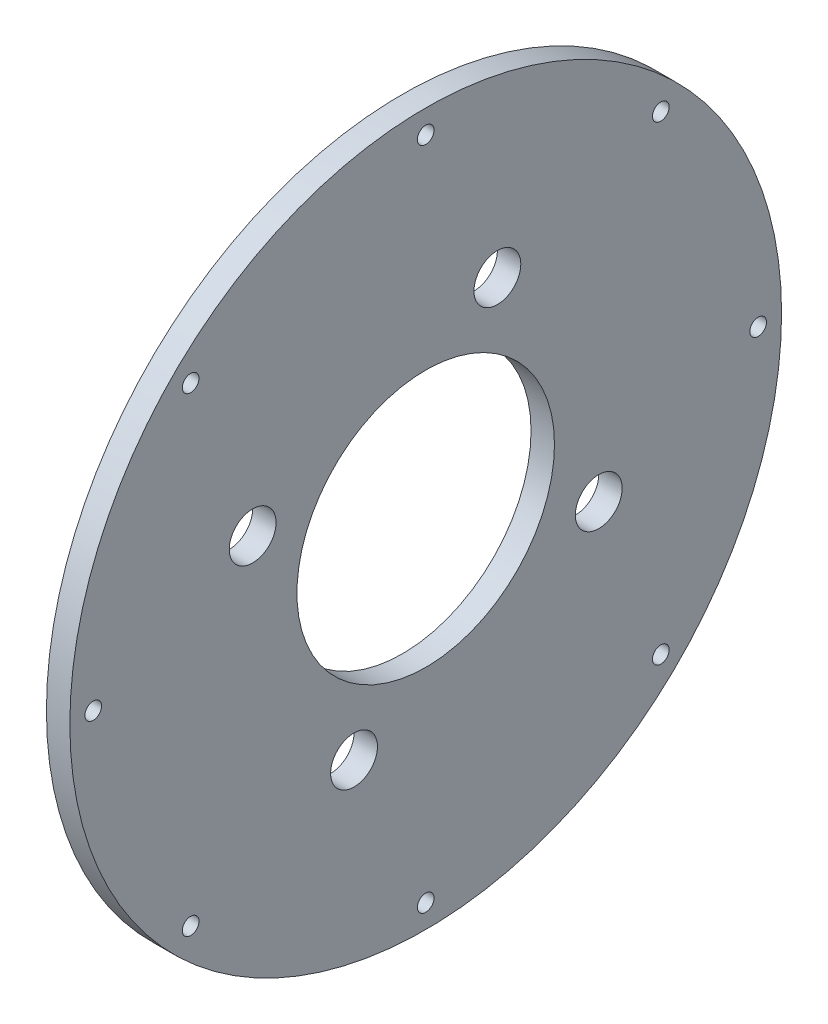
ISO-10303-21;
HEADER;
FILE_DESCRIPTION(('STEP AP214'),'2;1');
FILE_NAME('part.step','',(''),(''),'','','');
FILE_SCHEMA(('AUTOMOTIVE_DESIGN { 1 0 10303 214 1 1 1 1 }'));
ENDSEC;
DATA;
#1=APPLICATION_CONTEXT('core data for automotive mechanical design processes');
#2=APPLICATION_PROTOCOL_DEFINITION('international standard','automotive_design',2000,#1);
#3=PRODUCT_CONTEXT('',#1,'mechanical');
#4=PRODUCT('Part','Part','',(#3));
#5=PRODUCT_RELATED_PRODUCT_CATEGORY('part','',(#4));
#6=PRODUCT_DEFINITION_FORMATION('','',#4);
#7=PRODUCT_DEFINITION_CONTEXT('part definition',#1,'design');
#8=PRODUCT_DEFINITION('design','',#6,#7);
#9=PRODUCT_DEFINITION_SHAPE('','',#8);
#10=(LENGTH_UNIT() NAMED_UNIT(*) SI_UNIT(.MILLI.,.METRE.));
#11=(NAMED_UNIT(*) PLANE_ANGLE_UNIT() SI_UNIT($,.RADIAN.));
#12=(NAMED_UNIT(*) SI_UNIT($,.STERADIAN.) SOLID_ANGLE_UNIT());
#13=UNCERTAINTY_MEASURE_WITH_UNIT(LENGTH_MEASURE(1.E-05),#10,'distance_accuracy_value','');
#14=(GEOMETRIC_REPRESENTATION_CONTEXT(3) GLOBAL_UNCERTAINTY_ASSIGNED_CONTEXT((#13)) GLOBAL_UNIT_ASSIGNED_CONTEXT((#10,
#11,#12)) REPRESENTATION_CONTEXT('',''));
#15=CARTESIAN_POINT('',(0.,0.,0.));
#16=DIRECTION('',(0.,0.,1.));
#17=DIRECTION('',(1.,0.,0.));
#18=AXIS2_PLACEMENT_3D('',#15,#16,#17);
#19=CARTESIAN_POINT('',(3.175,0.,0.));
#20=DIRECTION('',(1.,0.,0.));
#21=DIRECTION('',(0.,0.,-1.));
#22=AXIS2_PLACEMENT_3D('',#19,#20,#21);
#23=PLANE('',#22);
#24=CARTESIAN_POINT('',(3.175,-23.4665401257866,9.72015918207268));
#25=DIRECTION('',(1.,0.,0.));
#26=DIRECTION('',(0.,0.,-1.));
#27=AXIS2_PLACEMENT_3D('',#24,#25,#26);
#28=CIRCLE('',#27,3.175);
#29=CARTESIAN_POINT('',(3.175,-23.4665401257866,6.54515918207267));
#30=VERTEX_POINT('',#29);
#31=EDGE_CURVE('E107',#30,#30,#28,.T.);
#32=ORIENTED_EDGE('',*,*,#31,.F.);
#33=EDGE_LOOP('',(#32));
#34=FACE_BOUND('',#33,.T.);
#35=CARTESIAN_POINT('',(3.175,23.4665401257866,-9.72015918207339));
#36=DIRECTION('',(1.,0.,0.));
#37=DIRECTION('',(0.,0.,-1.));
#38=AXIS2_PLACEMENT_3D('',#35,#36,#37);
#39=CIRCLE('',#38,3.175);
#40=CARTESIAN_POINT('',(3.175,23.4665401257866,-12.8951591820734));
#41=VERTEX_POINT('',#40);
#42=EDGE_CURVE('E95',#41,#41,#39,.T.);
#43=ORIENTED_EDGE('',*,*,#42,.F.);
#44=EDGE_LOOP('',(#43));
#45=FACE_BOUND('',#44,.T.);
#46=CARTESIAN_POINT('',(3.175,-6.5726235503307E-13,45.0849999999994));
#47=DIRECTION('',(1.,0.,0.));
#48=DIRECTION('',(0.,0.,-1.));
#49=AXIS2_PLACEMENT_3D('',#46,#47,#48);
#50=CIRCLE('',#49,1.1303);
#51=CARTESIAN_POINT('',(3.175,-6.5726235503307E-13,43.9546999999994));
#52=VERTEX_POINT('',#51);
#53=EDGE_CURVE('E83',#52,#52,#50,.T.);
#54=ORIENTED_EDGE('',*,*,#53,.F.);
#55=EDGE_LOOP('',(#54));
#56=FACE_BOUND('',#55,.T.);
#57=CARTESIAN_POINT('',(3.175,-45.085,-1.28329082477408E-12));
#58=DIRECTION('',(1.,0.,0.));
#59=DIRECTION('',(0.,0.,-1.));
#60=AXIS2_PLACEMENT_3D('',#57,#58,#59);
#61=CIRCLE('',#60,1.1303);
#62=CARTESIAN_POINT('',(3.175,-45.085,-1.13030000000128));
#63=VERTEX_POINT('',#62);
#64=EDGE_CURVE('E71',#63,#63,#61,.T.);
#65=ORIENTED_EDGE('',*,*,#64,.F.);
#66=EDGE_LOOP('',(#65));
#67=FACE_BOUND('',#66,.T.);
#68=CARTESIAN_POINT('',(3.175,-1.57413436161743E-13,-45.085));
#69=DIRECTION('',(1.,0.,0.));
#70=DIRECTION('',(0.,0.,-1.));
#71=AXIS2_PLACEMENT_3D('',#68,#69,#70);
#72=CIRCLE('',#71,1.1303);
#73=CARTESIAN_POINT('',(3.175,-1.57413436161743E-13,-46.2153));
#74=VERTEX_POINT('',#73);
#75=EDGE_CURVE('E59',#74,#74,#72,.T.);
#76=ORIENTED_EDGE('',*,*,#75,.F.);
#77=EDGE_LOOP('',(#76));
#78=FACE_BOUND('',#77,.T.);
#79=CARTESIAN_POINT('',(3.175,0.,0.));
#80=DIRECTION('',(1.,0.,0.));
#81=DIRECTION('',(0.,0.,-1.));
#82=AXIS2_PLACEMENT_3D('',#79,#80,#81);
#83=CIRCLE('',#82,17.4625);
#84=CARTESIAN_POINT('',(3.175,0.,-17.4625));
#85=VERTEX_POINT('',#84);
#86=EDGE_CURVE('E47',#85,#85,#83,.T.);
#87=ORIENTED_EDGE('',*,*,#86,.F.);
#88=EDGE_LOOP('',(#87));
#89=FACE_BOUND('',#88,.T.);
#90=CARTESIAN_POINT('',(3.175,0.,0.));
#91=DIRECTION('',(1.,0.,0.));
#92=DIRECTION('',(0.,0.,-1.));
#93=AXIS2_PLACEMENT_3D('',#90,#91,#92);
#94=CIRCLE('',#93,48.26);
#95=CARTESIAN_POINT('',(3.175,0.,-48.26));
#96=VERTEX_POINT('',#95);
#97=EDGE_CURVE('E10',#96,#96,#94,.T.);
#98=ORIENTED_EDGE('',*,*,#97,.T.);
#99=EDGE_LOOP('',(#98));
#100=FACE_BOUND('',#99,.T.);
#101=CARTESIAN_POINT('',(3.175,45.085,0.));
#102=DIRECTION('',(1.,0.,0.));
#103=DIRECTION('',(0.,0.,-1.));
#104=AXIS2_PLACEMENT_3D('',#101,#102,#103);
#105=CIRCLE('',#104,1.1303);
#106=CARTESIAN_POINT('',(3.175,45.085,-1.1303));
#107=VERTEX_POINT('',#106);
#108=EDGE_CURVE('E42',#107,#107,#105,.T.);
#109=ORIENTED_EDGE('',*,*,#108,.F.);
#110=EDGE_LOOP('',(#109));
#111=FACE_BOUND('',#110,.T.);
#112=CARTESIAN_POINT('',(3.175,31.8799092297954,-31.8799092297955));
#113=DIRECTION('',(1.,0.,0.));
#114=DIRECTION('',(0.,0.,-1.));
#115=AXIS2_PLACEMENT_3D('',#112,#113,#114);
#116=CIRCLE('',#115,1.1303);
#117=CARTESIAN_POINT('',(3.175,31.8799092297954,-33.0102092297955));
#118=VERTEX_POINT('',#117);
#119=EDGE_CURVE('E53',#118,#118,#116,.T.);
#120=ORIENTED_EDGE('',*,*,#119,.F.);
#121=EDGE_LOOP('',(#120));
#122=FACE_BOUND('',#121,.T.);
#123=CARTESIAN_POINT('',(3.175,-31.879909229795,-31.8799092297966));
#124=DIRECTION('',(1.,0.,0.));
#125=DIRECTION('',(0.,0.,-1.));
#126=AXIS2_PLACEMENT_3D('',#123,#124,#125);
#127=CIRCLE('',#126,1.1303);
#128=CARTESIAN_POINT('',(3.175,-31.879909229795,-33.0102092297966));
#129=VERTEX_POINT('',#128);
#130=EDGE_CURVE('E65',#129,#129,#127,.T.);
#131=ORIENTED_EDGE('',*,*,#130,.F.);
#132=EDGE_LOOP('',(#131));
#133=FACE_BOUND('',#132,.T.);
#134=CARTESIAN_POINT('',(3.175,-31.879909229796,31.8799092297944));
#135=DIRECTION('',(1.,0.,0.));
#136=DIRECTION('',(0.,0.,-1.));
#137=AXIS2_PLACEMENT_3D('',#134,#135,#136);
#138=CIRCLE('',#137,1.1303);
#139=CARTESIAN_POINT('',(3.175,-31.879909229796,30.7496092297944));
#140=VERTEX_POINT('',#139);
#141=EDGE_CURVE('E77',#140,#140,#138,.T.);
#142=ORIENTED_EDGE('',*,*,#141,.F.);
#143=EDGE_LOOP('',(#142));
#144=FACE_BOUND('',#143,.T.);
#145=CARTESIAN_POINT('',(3.175,31.8799092297959,31.8799092297951));
#146=DIRECTION('',(1.,0.,0.));
#147=DIRECTION('',(0.,0.,-1.));
#148=AXIS2_PLACEMENT_3D('',#145,#146,#147);
#149=CIRCLE('',#148,1.1303);
#150=CARTESIAN_POINT('',(3.175,31.8799092297959,30.7496092297951));
#151=VERTEX_POINT('',#150);
#152=EDGE_CURVE('E89',#151,#151,#149,.T.);
#153=ORIENTED_EDGE('',*,*,#152,.F.);
#154=EDGE_LOOP('',(#153));
#155=FACE_BOUND('',#154,.T.);
#156=CARTESIAN_POINT('',(3.175,-9.72015918207303,-23.466540125787));
#157=DIRECTION('',(1.,0.,0.));
#158=DIRECTION('',(0.,0.,-1.));
#159=AXIS2_PLACEMENT_3D('',#156,#157,#158);
#160=CIRCLE('',#159,3.175);
#161=CARTESIAN_POINT('',(3.175,-9.72015918207303,-26.641540125787));
#162=VERTEX_POINT('',#161);
#163=EDGE_CURVE('E101',#162,#162,#160,.T.);
#164=ORIENTED_EDGE('',*,*,#163,.F.);
#165=EDGE_LOOP('',(#164));
#166=FACE_BOUND('',#165,.T.);
#167=CARTESIAN_POINT('',(3.175,9.72015918207304,23.4665401257863));
#168=DIRECTION('',(1.,0.,0.));
#169=DIRECTION('',(0.,0.,-1.));
#170=AXIS2_PLACEMENT_3D('',#167,#168,#169);
#171=CIRCLE('',#170,3.175);
#172=CARTESIAN_POINT('',(3.175,9.72015918207304,20.2915401257863));
#173=VERTEX_POINT('',#172);
#174=EDGE_CURVE('E113',#173,#173,#171,.T.);
#175=ORIENTED_EDGE('',*,*,#174,.F.);
#176=EDGE_LOOP('',(#175));
#177=FACE_BOUND('',#176,.T.);
#178=ADVANCED_FACE('F31',(#34,#45,#56,#67,#78,#89,#100,#111,#122,#133,#144,#155,#166,#177),#23,.T.);
#179=CARTESIAN_POINT('',(0.,0.,0.));
#180=DIRECTION('',(1.,0.,0.));
#181=DIRECTION('',(0.,0.,-1.));
#182=AXIS2_PLACEMENT_3D('',#179,#180,#181);
#183=PLANE('',#182);
#184=CARTESIAN_POINT('',(0.,-23.4665401257866,9.72015918207268));
#185=DIRECTION('',(1.,0.,0.));
#186=DIRECTION('',(0.,0.,-1.));
#187=AXIS2_PLACEMENT_3D('',#184,#185,#186);
#188=CIRCLE('',#187,3.175);
#189=CARTESIAN_POINT('',(0.,-23.4665401257866,6.54515918207267));
#190=VERTEX_POINT('',#189);
#191=EDGE_CURVE('E110',#190,#190,#188,.T.);
#192=ORIENTED_EDGE('',*,*,#191,.T.);
#193=EDGE_LOOP('',(#192));
#194=FACE_BOUND('',#193,.T.);
#195=CARTESIAN_POINT('',(0.,23.4665401257866,-9.72015918207339));
#196=DIRECTION('',(1.,0.,0.));
#197=DIRECTION('',(0.,0.,-1.));
#198=AXIS2_PLACEMENT_3D('',#195,#196,#197);
#199=CIRCLE('',#198,3.175);
#200=CARTESIAN_POINT('',(0.,23.4665401257866,-12.8951591820734));
#201=VERTEX_POINT('',#200);
#202=EDGE_CURVE('E98',#201,#201,#199,.T.);
#203=ORIENTED_EDGE('',*,*,#202,.T.);
#204=EDGE_LOOP('',(#203));
#205=FACE_BOUND('',#204,.T.);
#206=CARTESIAN_POINT('',(0.,-6.5726235503307E-13,45.0849999999994));
#207=DIRECTION('',(1.,0.,0.));
#208=DIRECTION('',(0.,0.,-1.));
#209=AXIS2_PLACEMENT_3D('',#206,#207,#208);
#210=CIRCLE('',#209,1.1303);
#211=CARTESIAN_POINT('',(0.,-6.5726235503307E-13,43.9546999999994));
#212=VERTEX_POINT('',#211);
#213=EDGE_CURVE('E86',#212,#212,#210,.T.);
#214=ORIENTED_EDGE('',*,*,#213,.T.);
#215=EDGE_LOOP('',(#214));
#216=FACE_BOUND('',#215,.T.);
#217=CARTESIAN_POINT('',(0.,-45.085,-1.28329082477408E-12));
#218=DIRECTION('',(1.,0.,0.));
#219=DIRECTION('',(0.,0.,-1.));
#220=AXIS2_PLACEMENT_3D('',#217,#218,#219);
#221=CIRCLE('',#220,1.1303);
#222=CARTESIAN_POINT('',(0.,-45.085,-1.13030000000128));
#223=VERTEX_POINT('',#222);
#224=EDGE_CURVE('E74',#223,#223,#221,.T.);
#225=ORIENTED_EDGE('',*,*,#224,.T.);
#226=EDGE_LOOP('',(#225));
#227=FACE_BOUND('',#226,.T.);
#228=CARTESIAN_POINT('',(0.,-1.57413436161743E-13,-45.085));
#229=DIRECTION('',(1.,0.,0.));
#230=DIRECTION('',(0.,0.,-1.));
#231=AXIS2_PLACEMENT_3D('',#228,#229,#230);
#232=CIRCLE('',#231,1.1303);
#233=CARTESIAN_POINT('',(0.,-1.57413436161743E-13,-46.2153));
#234=VERTEX_POINT('',#233);
#235=EDGE_CURVE('E62',#234,#234,#232,.T.);
#236=ORIENTED_EDGE('',*,*,#235,.T.);
#237=EDGE_LOOP('',(#236));
#238=FACE_BOUND('',#237,.T.);
#239=CARTESIAN_POINT('',(0.,0.,0.));
#240=DIRECTION('',(1.,0.,0.));
#241=DIRECTION('',(0.,0.,-1.));
#242=AXIS2_PLACEMENT_3D('',#239,#240,#241);
#243=CIRCLE('',#242,17.4625);
#244=CARTESIAN_POINT('',(0.,0.,-17.4625));
#245=VERTEX_POINT('',#244);
#246=EDGE_CURVE('E50',#245,#245,#243,.T.);
#247=ORIENTED_EDGE('',*,*,#246,.T.);
#248=EDGE_LOOP('',(#247));
#249=FACE_BOUND('',#248,.T.);
#250=CARTESIAN_POINT('',(0.,0.,0.));
#251=DIRECTION('',(1.,0.,0.));
#252=DIRECTION('',(0.,0.,-1.));
#253=AXIS2_PLACEMENT_3D('',#250,#251,#252);
#254=CIRCLE('',#253,48.26);
#255=CARTESIAN_POINT('',(0.,0.,-48.26));
#256=VERTEX_POINT('',#255);
#257=EDGE_CURVE('E35',#256,#256,#254,.T.);
#258=ORIENTED_EDGE('',*,*,#257,.F.);
#259=EDGE_LOOP('',(#258));
#260=FACE_BOUND('',#259,.T.);
#261=CARTESIAN_POINT('',(0.,45.085,0.));
#262=DIRECTION('',(1.,0.,0.));
#263=DIRECTION('',(0.,0.,-1.));
#264=AXIS2_PLACEMENT_3D('',#261,#262,#263);
#265=CIRCLE('',#264,1.1303);
#266=CARTESIAN_POINT('',(0.,45.085,-1.1303));
#267=VERTEX_POINT('',#266);
#268=EDGE_CURVE('E44',#267,#267,#265,.T.);
#269=ORIENTED_EDGE('',*,*,#268,.T.);
#270=EDGE_LOOP('',(#269));
#271=FACE_BOUND('',#270,.T.);
#272=CARTESIAN_POINT('',(0.,31.8799092297954,-31.8799092297955));
#273=DIRECTION('',(1.,0.,0.));
#274=DIRECTION('',(0.,0.,-1.));
#275=AXIS2_PLACEMENT_3D('',#272,#273,#274);
#276=CIRCLE('',#275,1.1303);
#277=CARTESIAN_POINT('',(0.,31.8799092297954,-33.0102092297955));
#278=VERTEX_POINT('',#277);
#279=EDGE_CURVE('E56',#278,#278,#276,.T.);
#280=ORIENTED_EDGE('',*,*,#279,.T.);
#281=EDGE_LOOP('',(#280));
#282=FACE_BOUND('',#281,.T.);
#283=CARTESIAN_POINT('',(0.,-31.879909229795,-31.8799092297966));
#284=DIRECTION('',(1.,0.,0.));
#285=DIRECTION('',(0.,0.,-1.));
#286=AXIS2_PLACEMENT_3D('',#283,#284,#285);
#287=CIRCLE('',#286,1.1303);
#288=CARTESIAN_POINT('',(0.,-31.879909229795,-33.0102092297966));
#289=VERTEX_POINT('',#288);
#290=EDGE_CURVE('E68',#289,#289,#287,.T.);
#291=ORIENTED_EDGE('',*,*,#290,.T.);
#292=EDGE_LOOP('',(#291));
#293=FACE_BOUND('',#292,.T.);
#294=CARTESIAN_POINT('',(0.,-31.879909229796,31.8799092297944));
#295=DIRECTION('',(1.,0.,0.));
#296=DIRECTION('',(0.,0.,-1.));
#297=AXIS2_PLACEMENT_3D('',#294,#295,#296);
#298=CIRCLE('',#297,1.1303);
#299=CARTESIAN_POINT('',(0.,-31.879909229796,30.7496092297944));
#300=VERTEX_POINT('',#299);
#301=EDGE_CURVE('E80',#300,#300,#298,.T.);
#302=ORIENTED_EDGE('',*,*,#301,.T.);
#303=EDGE_LOOP('',(#302));
#304=FACE_BOUND('',#303,.T.);
#305=CARTESIAN_POINT('',(0.,31.8799092297959,31.8799092297951));
#306=DIRECTION('',(1.,0.,0.));
#307=DIRECTION('',(0.,0.,-1.));
#308=AXIS2_PLACEMENT_3D('',#305,#306,#307);
#309=CIRCLE('',#308,1.1303);
#310=CARTESIAN_POINT('',(0.,31.8799092297959,30.7496092297951));
#311=VERTEX_POINT('',#310);
#312=EDGE_CURVE('E92',#311,#311,#309,.T.);
#313=ORIENTED_EDGE('',*,*,#312,.T.);
#314=EDGE_LOOP('',(#313));
#315=FACE_BOUND('',#314,.T.);
#316=CARTESIAN_POINT('',(0.,-9.72015918207303,-23.466540125787));
#317=DIRECTION('',(1.,0.,0.));
#318=DIRECTION('',(0.,0.,-1.));
#319=AXIS2_PLACEMENT_3D('',#316,#317,#318);
#320=CIRCLE('',#319,3.175);
#321=CARTESIAN_POINT('',(0.,-9.72015918207303,-26.641540125787));
#322=VERTEX_POINT('',#321);
#323=EDGE_CURVE('E104',#322,#322,#320,.T.);
#324=ORIENTED_EDGE('',*,*,#323,.T.);
#325=EDGE_LOOP('',(#324));
#326=FACE_BOUND('',#325,.T.);
#327=CARTESIAN_POINT('',(0.,9.72015918207304,23.4665401257863));
#328=DIRECTION('',(1.,0.,0.));
#329=DIRECTION('',(0.,0.,-1.));
#330=AXIS2_PLACEMENT_3D('',#327,#328,#329);
#331=CIRCLE('',#330,3.175);
#332=CARTESIAN_POINT('',(0.,9.72015918207304,20.2915401257863));
#333=VERTEX_POINT('',#332);
#334=EDGE_CURVE('E116',#333,#333,#331,.T.);
#335=ORIENTED_EDGE('',*,*,#334,.T.);
#336=EDGE_LOOP('',(#335));
#337=FACE_BOUND('',#336,.T.);
#338=ADVANCED_FACE('F126',(#194,#205,#216,#227,#238,#249,#260,#271,#282,#293,#304,#315,#326,
#337),#183,.F.);
#339=CARTESIAN_POINT('',(3.175,0.,0.));
#340=DIRECTION('',(-1.,0.,0.));
#341=DIRECTION('',(0.,0.,1.));
#342=AXIS2_PLACEMENT_3D('',#339,#340,#341);
#343=CYLINDRICAL_SURFACE('',#342,48.26);
#344=ORIENTED_EDGE('',*,*,#97,.F.);
#345=EDGE_LOOP('',(#344));
#346=FACE_BOUND('',#345,.T.);
#347=ORIENTED_EDGE('',*,*,#257,.T.);
#348=EDGE_LOOP('',(#347));
#349=FACE_BOUND('',#348,.T.);
#350=ADVANCED_FACE('F33',(#346,#349),#343,.T.);
#351=CARTESIAN_POINT('',(3.175,45.085,0.));
#352=DIRECTION('',(-1.,0.,0.));
#353=DIRECTION('',(0.,0.,1.));
#354=AXIS2_PLACEMENT_3D('',#351,#352,#353);
#355=CYLINDRICAL_SURFACE('',#354,1.1303);
#356=ORIENTED_EDGE('',*,*,#108,.T.);
#357=EDGE_LOOP('',(#356));
#358=FACE_BOUND('',#357,.T.);
#359=ORIENTED_EDGE('',*,*,#268,.F.);
#360=EDGE_LOOP('',(#359));
#361=FACE_BOUND('',#360,.T.);
#362=ADVANCED_FACE('F136',(#358,#361),#355,.F.);
#363=CARTESIAN_POINT('',(3.175,0.,0.));
#364=DIRECTION('',(-1.,0.,0.));
#365=DIRECTION('',(0.,0.,1.));
#366=AXIS2_PLACEMENT_3D('',#363,#364,#365);
#367=CYLINDRICAL_SURFACE('',#366,17.4625);
#368=ORIENTED_EDGE('',*,*,#86,.T.);
#369=EDGE_LOOP('',(#368));
#370=FACE_BOUND('',#369,.T.);
#371=ORIENTED_EDGE('',*,*,#246,.F.);
#372=EDGE_LOOP('',(#371));
#373=FACE_BOUND('',#372,.T.);
#374=ADVANCED_FACE('F139',(#370,#373),#367,.F.);
#375=CARTESIAN_POINT('',(3.175,31.8799092297954,-31.8799092297955));
#376=DIRECTION('',(-1.,0.,0.));
#377=DIRECTION('',(0.,0.,1.));
#378=AXIS2_PLACEMENT_3D('',#375,#376,#377);
#379=CYLINDRICAL_SURFACE('',#378,1.1303);
#380=ORIENTED_EDGE('',*,*,#119,.T.);
#381=EDGE_LOOP('',(#380));
#382=FACE_BOUND('',#381,.T.);
#383=ORIENTED_EDGE('',*,*,#279,.F.);
#384=EDGE_LOOP('',(#383));
#385=FACE_BOUND('',#384,.T.);
#386=ADVANCED_FACE('F143',(#382,#385),#379,.F.);
#387=CARTESIAN_POINT('',(3.175,-1.57413436161743E-13,-45.085));
#388=DIRECTION('',(-1.,0.,0.));
#389=DIRECTION('',(0.,0.,1.));
#390=AXIS2_PLACEMENT_3D('',#387,#388,#389);
#391=CYLINDRICAL_SURFACE('',#390,1.1303);
#392=ORIENTED_EDGE('',*,*,#75,.T.);
#393=EDGE_LOOP('',(#392));
#394=FACE_BOUND('',#393,.T.);
#395=ORIENTED_EDGE('',*,*,#235,.F.);
#396=EDGE_LOOP('',(#395));
#397=FACE_BOUND('',#396,.T.);
#398=ADVANCED_FACE('F147',(#394,#397),#391,.F.);
#399=CARTESIAN_POINT('',(3.175,-31.879909229795,-31.8799092297966));
#400=DIRECTION('',(-1.,0.,0.));
#401=DIRECTION('',(0.,0.,1.));
#402=AXIS2_PLACEMENT_3D('',#399,#400,#401);
#403=CYLINDRICAL_SURFACE('',#402,1.1303);
#404=ORIENTED_EDGE('',*,*,#130,.T.);
#405=EDGE_LOOP('',(#404));
#406=FACE_BOUND('',#405,.T.);
#407=ORIENTED_EDGE('',*,*,#290,.F.);
#408=EDGE_LOOP('',(#407));
#409=FACE_BOUND('',#408,.T.);
#410=ADVANCED_FACE('F151',(#406,#409),#403,.F.);
#411=CARTESIAN_POINT('',(3.175,-45.085,-1.28329082477408E-12));
#412=DIRECTION('',(-1.,0.,0.));
#413=DIRECTION('',(0.,0.,1.));
#414=AXIS2_PLACEMENT_3D('',#411,#412,#413);
#415=CYLINDRICAL_SURFACE('',#414,1.1303);
#416=ORIENTED_EDGE('',*,*,#64,.T.);
#417=EDGE_LOOP('',(#416));
#418=FACE_BOUND('',#417,.T.);
#419=ORIENTED_EDGE('',*,*,#224,.F.);
#420=EDGE_LOOP('',(#419));
#421=FACE_BOUND('',#420,.T.);
#422=ADVANCED_FACE('F155',(#418,#421),#415,.F.);
#423=CARTESIAN_POINT('',(3.175,-31.879909229796,31.8799092297944));
#424=DIRECTION('',(-1.,0.,0.));
#425=DIRECTION('',(0.,0.,1.));
#426=AXIS2_PLACEMENT_3D('',#423,#424,#425);
#427=CYLINDRICAL_SURFACE('',#426,1.1303);
#428=ORIENTED_EDGE('',*,*,#141,.T.);
#429=EDGE_LOOP('',(#428));
#430=FACE_BOUND('',#429,.T.);
#431=ORIENTED_EDGE('',*,*,#301,.F.);
#432=EDGE_LOOP('',(#431));
#433=FACE_BOUND('',#432,.T.);
#434=ADVANCED_FACE('F159',(#430,#433),#427,.F.);
#435=CARTESIAN_POINT('',(3.175,-6.5726235503307E-13,45.0849999999994));
#436=DIRECTION('',(-1.,0.,0.));
#437=DIRECTION('',(0.,0.,1.));
#438=AXIS2_PLACEMENT_3D('',#435,#436,#437);
#439=CYLINDRICAL_SURFACE('',#438,1.1303);
#440=ORIENTED_EDGE('',*,*,#53,.T.);
#441=EDGE_LOOP('',(#440));
#442=FACE_BOUND('',#441,.T.);
#443=ORIENTED_EDGE('',*,*,#213,.F.);
#444=EDGE_LOOP('',(#443));
#445=FACE_BOUND('',#444,.T.);
#446=ADVANCED_FACE('F163',(#442,#445),#439,.F.);
#447=CARTESIAN_POINT('',(3.175,31.8799092297959,31.8799092297951));
#448=DIRECTION('',(-1.,0.,0.));
#449=DIRECTION('',(0.,0.,1.));
#450=AXIS2_PLACEMENT_3D('',#447,#448,#449);
#451=CYLINDRICAL_SURFACE('',#450,1.1303);
#452=ORIENTED_EDGE('',*,*,#152,.T.);
#453=EDGE_LOOP('',(#452));
#454=FACE_BOUND('',#453,.T.);
#455=ORIENTED_EDGE('',*,*,#312,.F.);
#456=EDGE_LOOP('',(#455));
#457=FACE_BOUND('',#456,.T.);
#458=ADVANCED_FACE('F167',(#454,#457),#451,.F.);
#459=CARTESIAN_POINT('',(3.175,23.4665401257866,-9.72015918207339));
#460=DIRECTION('',(-1.,0.,0.));
#461=DIRECTION('',(0.,0.,1.));
#462=AXIS2_PLACEMENT_3D('',#459,#460,#461);
#463=CYLINDRICAL_SURFACE('',#462,3.175);
#464=ORIENTED_EDGE('',*,*,#42,.T.);
#465=EDGE_LOOP('',(#464));
#466=FACE_BOUND('',#465,.T.);
#467=ORIENTED_EDGE('',*,*,#202,.F.);
#468=EDGE_LOOP('',(#467));
#469=FACE_BOUND('',#468,.T.);
#470=ADVANCED_FACE('F171',(#466,#469),#463,.F.);
#471=CARTESIAN_POINT('',(3.175,-9.72015918207303,-23.466540125787));
#472=DIRECTION('',(-1.,0.,0.));
#473=DIRECTION('',(0.,0.,1.));
#474=AXIS2_PLACEMENT_3D('',#471,#472,#473);
#475=CYLINDRICAL_SURFACE('',#474,3.175);
#476=ORIENTED_EDGE('',*,*,#163,.T.);
#477=EDGE_LOOP('',(#476));
#478=FACE_BOUND('',#477,.T.);
#479=ORIENTED_EDGE('',*,*,#323,.F.);
#480=EDGE_LOOP('',(#479));
#481=FACE_BOUND('',#480,.T.);
#482=ADVANCED_FACE('F175',(#478,#481),#475,.F.);
#483=CARTESIAN_POINT('',(3.175,-23.4665401257866,9.72015918207268));
#484=DIRECTION('',(-1.,0.,0.));
#485=DIRECTION('',(0.,0.,1.));
#486=AXIS2_PLACEMENT_3D('',#483,#484,#485);
#487=CYLINDRICAL_SURFACE('',#486,3.175);
#488=ORIENTED_EDGE('',*,*,#31,.T.);
#489=EDGE_LOOP('',(#488));
#490=FACE_BOUND('',#489,.T.);
#491=ORIENTED_EDGE('',*,*,#191,.F.);
#492=EDGE_LOOP('',(#491));
#493=FACE_BOUND('',#492,.T.);
#494=ADVANCED_FACE('F179',(#490,#493),#487,.F.);
#495=CARTESIAN_POINT('',(3.175,9.72015918207304,23.4665401257863));
#496=DIRECTION('',(-1.,0.,0.));
#497=DIRECTION('',(0.,0.,1.));
#498=AXIS2_PLACEMENT_3D('',#495,#496,#497);
#499=CYLINDRICAL_SURFACE('',#498,3.175);
#500=ORIENTED_EDGE('',*,*,#174,.T.);
#501=EDGE_LOOP('',(#500));
#502=FACE_BOUND('',#501,.T.);
#503=ORIENTED_EDGE('',*,*,#334,.F.);
#504=EDGE_LOOP('',(#503));
#505=FACE_BOUND('',#504,.T.);
#506=ADVANCED_FACE('F122',(#502,#505),#499,.F.);
#507=CLOSED_SHELL('',(#178,#338,#350,#362,#374,#386,#398,#410,#422,#434,#446,#458,#470,#482,
#494,#506));
#508=MANIFOLD_SOLID_BREP('B2',#507);
#509=ADVANCED_BREP_SHAPE_REPRESENTATION('',(#18,#508),#14);
#510=SHAPE_DEFINITION_REPRESENTATION(#9,#509);
ENDSEC;
END-ISO-10303-21;
